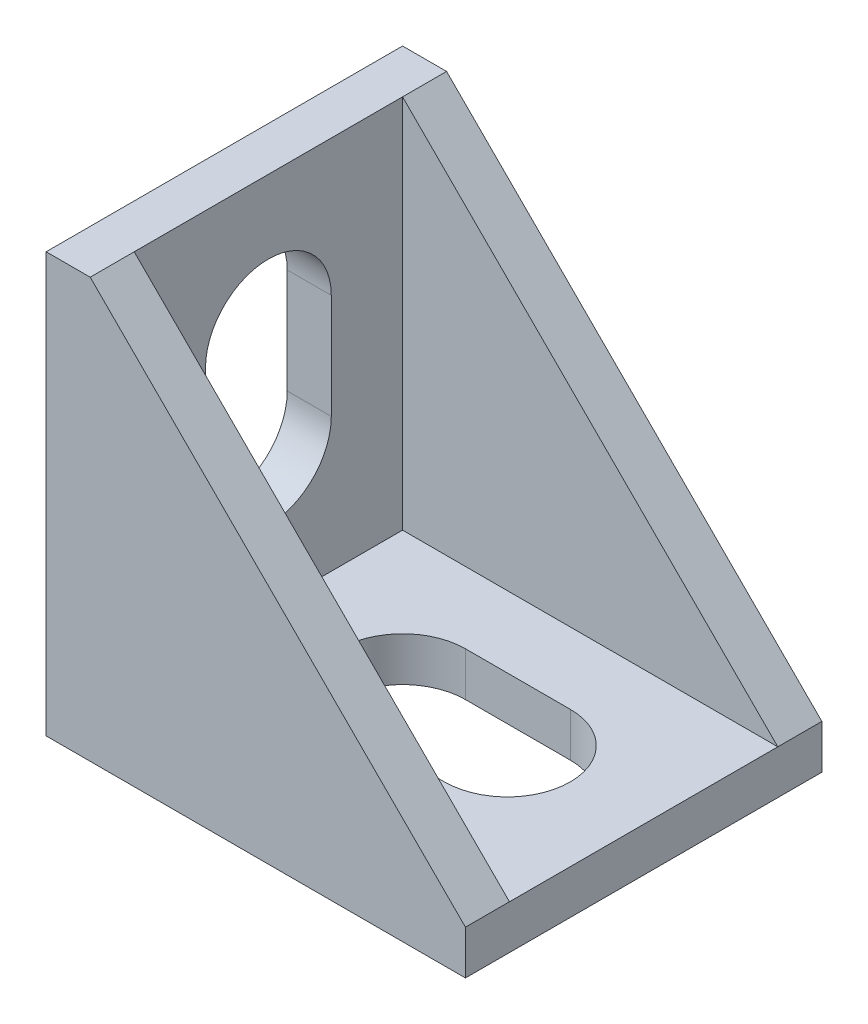
ISO-10303-21;
HEADER;
FILE_DESCRIPTION(('STEP AP214'),'2;1');
FILE_NAME('part.step','',(''),(''),'','','');
FILE_SCHEMA(('AUTOMOTIVE_DESIGN { 1 0 10303 214 1 1 1 1 }'));
ENDSEC;
DATA;
#1=APPLICATION_CONTEXT('core data for automotive mechanical design processes');
#2=APPLICATION_PROTOCOL_DEFINITION('international standard','automotive_design',2000,#1);
#3=PRODUCT_CONTEXT('',#1,'mechanical');
#4=PRODUCT('Part','Part','',(#3));
#5=PRODUCT_RELATED_PRODUCT_CATEGORY('part','',(#4));
#6=PRODUCT_DEFINITION_FORMATION('','',#4);
#7=PRODUCT_DEFINITION_CONTEXT('part definition',#1,'design');
#8=PRODUCT_DEFINITION('design','',#6,#7);
#9=PRODUCT_DEFINITION_SHAPE('','',#8);
#10=(LENGTH_UNIT() NAMED_UNIT(*) SI_UNIT(.MILLI.,.METRE.));
#11=(NAMED_UNIT(*) PLANE_ANGLE_UNIT() SI_UNIT($,.RADIAN.));
#12=(NAMED_UNIT(*) SI_UNIT($,.STERADIAN.) SOLID_ANGLE_UNIT());
#13=UNCERTAINTY_MEASURE_WITH_UNIT(LENGTH_MEASURE(1.E-05),#10,'distance_accuracy_value','');
#14=(GEOMETRIC_REPRESENTATION_CONTEXT(3) GLOBAL_UNCERTAINTY_ASSIGNED_CONTEXT((#13)) GLOBAL_UNIT_ASSIGNED_CONTEXT((#10,
#11,#12)) REPRESENTATION_CONTEXT('',''));
#15=CARTESIAN_POINT('',(0.,0.,0.));
#16=DIRECTION('',(0.,0.,1.));
#17=DIRECTION('',(1.,0.,0.));
#18=AXIS2_PLACEMENT_3D('',#15,#16,#17);
#19=CARTESIAN_POINT('',(20.,2.1,17.));
#20=DIRECTION('',(0.,-1.,0.));
#21=DIRECTION('',(1.,0.,0.));
#22=AXIS2_PLACEMENT_3D('',#19,#20,#21);
#23=PLANE('',#22);
#24=DIRECTION('',(1.,0.,0.));
#25=VECTOR('',#24,1.);
#26=CARTESIAN_POINT('',(8.5,2.1,11.5));
#27=LINE('',#26,#25);
#28=CARTESIAN_POINT('',(8.5,2.1,11.5));
#29=VERTEX_POINT('',#28);
#30=CARTESIAN_POINT('',(13.5,2.1,11.5));
#31=VERTEX_POINT('',#30);
#32=EDGE_CURVE('E176',#29,#31,#27,.T.);
#33=ORIENTED_EDGE('',*,*,#32,.F.);
#34=CARTESIAN_POINT('',(8.5,2.1,8.5));
#35=DIRECTION('',(0.,1.,0.));
#36=DIRECTION('',(-1.,0.,0.));
#37=AXIS2_PLACEMENT_3D('',#34,#35,#36);
#38=CIRCLE('',#37,3.);
#39=CARTESIAN_POINT('',(8.5,2.1,5.5));
#40=VERTEX_POINT('',#39);
#41=EDGE_CURVE('E51',#40,#29,#38,.T.);
#42=ORIENTED_EDGE('',*,*,#41,.F.);
#43=DIRECTION('',(-1.,0.,0.));
#44=VECTOR('',#43,1.);
#45=CARTESIAN_POINT('',(13.5,2.1,5.5));
#46=LINE('',#45,#44);
#47=CARTESIAN_POINT('',(13.5,2.1,5.5));
#48=VERTEX_POINT('',#47);
#49=EDGE_CURVE('E167',#48,#40,#46,.T.);
#50=ORIENTED_EDGE('',*,*,#49,.F.);
#51=CARTESIAN_POINT('',(13.5,2.1,8.5));
#52=DIRECTION('',(0.,1.,0.));
#53=DIRECTION('',(-1.,0.,0.));
#54=AXIS2_PLACEMENT_3D('',#51,#52,#53);
#55=CIRCLE('',#54,3.);
#56=EDGE_CURVE('E170',#31,#48,#55,.T.);
#57=ORIENTED_EDGE('',*,*,#56,.F.);
#58=EDGE_LOOP('',(#33,#42,#50,#57));
#59=FACE_BOUND('',#58,.T.);
#60=DIRECTION('',(1.,0.,0.));
#61=VECTOR('',#60,1.);
#62=CARTESIAN_POINT('',(2.1,2.1,14.9));
#63=LINE('',#62,#61);
#64=CARTESIAN_POINT('',(2.1,2.1,14.9));
#65=VERTEX_POINT('',#64);
#66=CARTESIAN_POINT('',(20.,2.1,14.9));
#67=VERTEX_POINT('',#66);
#68=EDGE_CURVE('E224',#65,#67,#63,.T.);
#69=ORIENTED_EDGE('',*,*,#68,.T.);
#70=DIRECTION('',(0.,0.,-1.));
#71=VECTOR('',#70,1.);
#72=CARTESIAN_POINT('',(20.,2.1,17.));
#73=LINE('',#72,#71);
#74=CARTESIAN_POINT('',(20.,2.1,2.1));
#75=VERTEX_POINT('',#74);
#76=EDGE_CURVE('E273',#67,#75,#73,.T.);
#77=ORIENTED_EDGE('',*,*,#76,.T.);
#78=DIRECTION('',(-1.,0.,0.));
#79=VECTOR('',#78,1.);
#80=CARTESIAN_POINT('',(2.1,2.1,2.1));
#81=LINE('',#80,#79);
#82=CARTESIAN_POINT('',(2.1,2.1,2.1));
#83=VERTEX_POINT('',#82);
#84=EDGE_CURVE('E232',#75,#83,#81,.T.);
#85=ORIENTED_EDGE('',*,*,#84,.T.);
#86=DIRECTION('',(0.,0.,-1.));
#87=VECTOR('',#86,1.);
#88=CARTESIAN_POINT('',(2.1,2.1,17.));
#89=LINE('',#88,#87);
#90=EDGE_CURVE('E271',#65,#83,#89,.T.);
#91=ORIENTED_EDGE('',*,*,#90,.F.);
#92=EDGE_LOOP('',(#69,#77,#85,#91));
#93=FACE_BOUND('',#92,.T.);
#94=ADVANCED_FACE('F36',(#59,#93),#23,.F.);
#95=CARTESIAN_POINT('',(2.1,2.1,17.));
#96=DIRECTION('',(-1.,0.,0.));
#97=DIRECTION('',(0.,-1.,0.));
#98=AXIS2_PLACEMENT_3D('',#95,#96,#97);
#99=PLANE('',#98);
#100=DIRECTION('',(0.,-1.,0.));
#101=VECTOR('',#100,1.);
#102=CARTESIAN_POINT('',(2.1,13.5,11.5));
#103=LINE('',#102,#101);
#104=CARTESIAN_POINT('',(2.1,13.5,11.5));
#105=VERTEX_POINT('',#104);
#106=CARTESIAN_POINT('',(2.1,8.5,11.5));
#107=VERTEX_POINT('',#106);
#108=EDGE_CURVE('E201',#105,#107,#103,.T.);
#109=ORIENTED_EDGE('',*,*,#108,.F.);
#110=CARTESIAN_POINT('',(2.1,13.5,8.5));
#111=DIRECTION('',(1.,0.,0.));
#112=DIRECTION('',(0.,1.,0.));
#113=AXIS2_PLACEMENT_3D('',#110,#111,#112);
#114=CIRCLE('',#113,3.);
#115=CARTESIAN_POINT('',(2.1,13.5,5.5));
#116=VERTEX_POINT('',#115);
#117=EDGE_CURVE('E182',#116,#105,#114,.T.);
#118=ORIENTED_EDGE('',*,*,#117,.F.);
#119=DIRECTION('',(0.,1.,0.));
#120=VECTOR('',#119,1.);
#121=CARTESIAN_POINT('',(2.1,13.5,5.5));
#122=LINE('',#121,#120);
#123=CARTESIAN_POINT('',(2.1,8.5,5.5));
#124=VERTEX_POINT('',#123);
#125=EDGE_CURVE('E190',#124,#116,#122,.T.);
#126=ORIENTED_EDGE('',*,*,#125,.F.);
#127=CARTESIAN_POINT('',(2.1,8.5,8.5));
#128=DIRECTION('',(1.,0.,0.));
#129=DIRECTION('',(0.,1.,0.));
#130=AXIS2_PLACEMENT_3D('',#127,#128,#129);
#131=CIRCLE('',#130,3.);
#132=EDGE_CURVE('E204',#107,#124,#131,.T.);
#133=ORIENTED_EDGE('',*,*,#132,.F.);
#134=EDGE_LOOP('',(#109,#118,#126,#133));
#135=FACE_BOUND('',#134,.T.);
#136=DIRECTION('',(0.,-1.,0.));
#137=VECTOR('',#136,1.);
#138=CARTESIAN_POINT('',(2.1,20.,14.9));
#139=LINE('',#138,#137);
#140=CARTESIAN_POINT('',(2.1,20.,14.9));
#141=VERTEX_POINT('',#140);
#142=EDGE_CURVE('E221',#141,#65,#139,.T.);
#143=ORIENTED_EDGE('',*,*,#142,.T.);
#144=ORIENTED_EDGE('',*,*,#90,.T.);
#145=DIRECTION('',(0.,1.,0.));
#146=VECTOR('',#145,1.);
#147=CARTESIAN_POINT('',(2.1,20.,2.1));
#148=LINE('',#147,#146);
#149=CARTESIAN_POINT('',(2.1,20.,2.1));
#150=VERTEX_POINT('',#149);
#151=EDGE_CURVE('E235',#83,#150,#148,.T.);
#152=ORIENTED_EDGE('',*,*,#151,.T.);
#153=DIRECTION('',(0.,0.,-1.));
#154=VECTOR('',#153,1.);
#155=CARTESIAN_POINT('',(2.1,20.,17.));
#156=LINE('',#155,#154);
#157=EDGE_CURVE('E267',#141,#150,#156,.T.);
#158=ORIENTED_EDGE('',*,*,#157,.F.);
#159=EDGE_LOOP('',(#143,#144,#152,#158));
#160=FACE_BOUND('',#159,.T.);
#161=ADVANCED_FACE('F304',(#135,#160),#99,.F.);
#162=CARTESIAN_POINT('',(0.,20.,17.));
#163=DIRECTION('',(1.,0.,0.));
#164=DIRECTION('',(0.,0.,-1.));
#165=AXIS2_PLACEMENT_3D('',#162,#163,#164);
#166=PLANE('',#165);
#167=DIRECTION('',(0.,1.,0.));
#168=VECTOR('',#167,1.);
#169=CARTESIAN_POINT('',(0.,13.5,5.5));
#170=LINE('',#169,#168);
#171=CARTESIAN_POINT('',(0.,8.5,5.5));
#172=VERTEX_POINT('',#171);
#173=CARTESIAN_POINT('',(0.,13.5,5.5));
#174=VERTEX_POINT('',#173);
#175=EDGE_CURVE('E196',#172,#174,#170,.T.);
#176=ORIENTED_EDGE('',*,*,#175,.T.);
#177=CARTESIAN_POINT('',(0.,13.5,8.5));
#178=DIRECTION('',(1.,0.,0.));
#179=DIRECTION('',(0.,1.,0.));
#180=AXIS2_PLACEMENT_3D('',#177,#178,#179);
#181=CIRCLE('',#180,3.);
#182=CARTESIAN_POINT('',(0.,13.5,11.5));
#183=VERTEX_POINT('',#182);
#184=EDGE_CURVE('E186',#174,#183,#181,.T.);
#185=ORIENTED_EDGE('',*,*,#184,.T.);
#186=DIRECTION('',(0.,-1.,0.));
#187=VECTOR('',#186,1.);
#188=CARTESIAN_POINT('',(0.,13.5,11.5));
#189=LINE('',#188,#187);
#190=CARTESIAN_POINT('',(0.,8.5,11.5));
#191=VERTEX_POINT('',#190);
#192=EDGE_CURVE('E189',#183,#191,#189,.T.);
#193=ORIENTED_EDGE('',*,*,#192,.T.);
#194=CARTESIAN_POINT('',(0.,8.5,8.5));
#195=DIRECTION('',(1.,0.,0.));
#196=DIRECTION('',(0.,1.,0.));
#197=AXIS2_PLACEMENT_3D('',#194,#195,#196);
#198=CIRCLE('',#197,3.);
#199=EDGE_CURVE('E193',#191,#172,#198,.T.);
#200=ORIENTED_EDGE('',*,*,#199,.T.);
#201=EDGE_LOOP('',(#176,#185,#193,#200));
#202=FACE_BOUND('',#201,.T.);
#203=DIRECTION('',(0.,-1.,0.));
#204=VECTOR('',#203,1.);
#205=CARTESIAN_POINT('',(0.,20.,0.));
#206=LINE('',#205,#204);
#207=CARTESIAN_POINT('',(0.,20.,0.));
#208=VERTEX_POINT('',#207);
#209=CARTESIAN_POINT('',(0.,0.,0.));
#210=VERTEX_POINT('',#209);
#211=EDGE_CURVE('E243',#208,#210,#206,.T.);
#212=ORIENTED_EDGE('',*,*,#211,.T.);
#213=DIRECTION('',(0.,0.,-1.));
#214=VECTOR('',#213,1.);
#215=CARTESIAN_POINT('',(0.,0.,17.));
#216=LINE('',#215,#214);
#217=CARTESIAN_POINT('',(0.,0.,17.));
#218=VERTEX_POINT('',#217);
#219=EDGE_CURVE('E11',#218,#210,#216,.T.);
#220=ORIENTED_EDGE('',*,*,#219,.F.);
#221=DIRECTION('',(0.,-1.,0.));
#222=VECTOR('',#221,1.);
#223=CARTESIAN_POINT('',(0.,20.,17.));
#224=LINE('',#223,#222);
#225=CARTESIAN_POINT('',(0.,20.,17.));
#226=VERTEX_POINT('',#225);
#227=EDGE_CURVE('E246',#226,#218,#224,.T.);
#228=ORIENTED_EDGE('',*,*,#227,.F.);
#229=DIRECTION('',(0.,0.,-1.));
#230=VECTOR('',#229,1.);
#231=CARTESIAN_POINT('',(0.,20.,17.));
#232=LINE('',#231,#230);
#233=EDGE_CURVE('E257',#226,#208,#232,.T.);
#234=ORIENTED_EDGE('',*,*,#233,.T.);
#235=EDGE_LOOP('',(#212,#220,#228,#234));
#236=FACE_BOUND('',#235,.T.);
#237=ADVANCED_FACE('F38',(#202,#236),#166,.F.);
#238=CARTESIAN_POINT('',(0.,0.,17.));
#239=DIRECTION('',(0.,1.,0.));
#240=DIRECTION('',(0.,0.,1.));
#241=AXIS2_PLACEMENT_3D('',#238,#239,#240);
#242=PLANE('',#241);
#243=DIRECTION('',(-1.,0.,0.));
#244=VECTOR('',#243,1.);
#245=CARTESIAN_POINT('',(13.5,0.,5.5));
#246=LINE('',#245,#244);
#247=CARTESIAN_POINT('',(13.5,0.,5.5));
#248=VERTEX_POINT('',#247);
#249=CARTESIAN_POINT('',(8.5,0.,5.5));
#250=VERTEX_POINT('',#249);
#251=EDGE_CURVE('E157',#248,#250,#246,.T.);
#252=ORIENTED_EDGE('',*,*,#251,.T.);
#253=CARTESIAN_POINT('',(8.5,0.,8.5));
#254=DIRECTION('',(0.,1.,0.));
#255=DIRECTION('',(-1.,0.,0.));
#256=AXIS2_PLACEMENT_3D('',#253,#254,#255);
#257=CIRCLE('',#256,3.);
#258=CARTESIAN_POINT('',(8.5,0.,11.5));
#259=VERTEX_POINT('',#258);
#260=EDGE_CURVE('E151',#250,#259,#257,.T.);
#261=ORIENTED_EDGE('',*,*,#260,.T.);
#262=DIRECTION('',(1.,0.,0.));
#263=VECTOR('',#262,1.);
#264=CARTESIAN_POINT('',(8.5,0.,11.5));
#265=LINE('',#264,#263);
#266=CARTESIAN_POINT('',(13.5,0.,11.5));
#267=VERTEX_POINT('',#266);
#268=EDGE_CURVE('E160',#259,#267,#265,.T.);
#269=ORIENTED_EDGE('',*,*,#268,.T.);
#270=CARTESIAN_POINT('',(13.5,0.,8.5));
#271=DIRECTION('',(0.,1.,0.));
#272=DIRECTION('',(-1.,0.,0.));
#273=AXIS2_PLACEMENT_3D('',#270,#271,#272);
#274=CIRCLE('',#273,3.);
#275=EDGE_CURVE('E59',#267,#248,#274,.T.);
#276=ORIENTED_EDGE('',*,*,#275,.T.);
#277=EDGE_LOOP('',(#252,#261,#269,#276));
#278=FACE_BOUND('',#277,.T.);
#279=DIRECTION('',(1.,0.,0.));
#280=VECTOR('',#279,1.);
#281=CARTESIAN_POINT('',(0.,0.,0.));
#282=LINE('',#281,#280);
#283=CARTESIAN_POINT('',(20.,0.,0.));
#284=VERTEX_POINT('',#283);
#285=EDGE_CURVE('E260',#210,#284,#282,.T.);
#286=ORIENTED_EDGE('',*,*,#285,.T.);
#287=DIRECTION('',(0.,0.,-1.));
#288=VECTOR('',#287,1.);
#289=CARTESIAN_POINT('',(20.,0.,17.));
#290=LINE('',#289,#288);
#291=CARTESIAN_POINT('',(20.,0.,17.));
#292=VERTEX_POINT('',#291);
#293=EDGE_CURVE('E44',#292,#284,#290,.T.);
#294=ORIENTED_EDGE('',*,*,#293,.F.);
#295=DIRECTION('',(1.,0.,0.));
#296=VECTOR('',#295,1.);
#297=CARTESIAN_POINT('',(0.,0.,17.));
#298=LINE('',#297,#296);
#299=EDGE_CURVE('E249',#218,#292,#298,.T.);
#300=ORIENTED_EDGE('',*,*,#299,.F.);
#301=ORIENTED_EDGE('',*,*,#219,.T.);
#302=EDGE_LOOP('',(#286,#294,#300,#301));
#303=FACE_BOUND('',#302,.T.);
#304=ADVANCED_FACE('F164',(#278,#303),#242,.F.);
#305=CARTESIAN_POINT('',(20.,0.,17.));
#306=DIRECTION('',(-1.,0.,0.));
#307=DIRECTION('',(0.,0.,1.));
#308=AXIS2_PLACEMENT_3D('',#305,#306,#307);
#309=PLANE('',#308);
#310=DIRECTION('',(0.,1.,0.));
#311=VECTOR('',#310,1.);
#312=CARTESIAN_POINT('',(20.,0.,0.));
#313=LINE('',#312,#311);
#314=CARTESIAN_POINT('',(20.,2.1,0.));
#315=VERTEX_POINT('',#314);
#316=EDGE_CURVE('E262',#284,#315,#313,.T.);
#317=ORIENTED_EDGE('',*,*,#316,.T.);
#318=DIRECTION('',(0.,0.,-1.));
#319=VECTOR('',#318,1.);
#320=CARTESIAN_POINT('',(20.,2.1,2.1));
#321=LINE('',#320,#319);
#322=EDGE_CURVE('E238',#75,#315,#321,.T.);
#323=ORIENTED_EDGE('',*,*,#322,.F.);
#324=ORIENTED_EDGE('',*,*,#76,.F.);
#325=CARTESIAN_POINT('',(20.,2.1,17.));
#326=VERTEX_POINT('',#325);
#327=EDGE_CURVE('E274',#326,#67,#73,.T.);
#328=ORIENTED_EDGE('',*,*,#327,.F.);
#329=DIRECTION('',(0.,1.,0.));
#330=VECTOR('',#329,1.);
#331=CARTESIAN_POINT('',(20.,0.,17.));
#332=LINE('',#331,#330);
#333=EDGE_CURVE('E252',#292,#326,#332,.T.);
#334=ORIENTED_EDGE('',*,*,#333,.F.);
#335=ORIENTED_EDGE('',*,*,#293,.T.);
#336=EDGE_LOOP('',(#317,#323,#324,#328,#334,#335));
#337=FACE_BOUND('',#336,.T.);
#338=ADVANCED_FACE('F280',(#337),#309,.F.);
#339=CARTESIAN_POINT('',(2.1,20.,17.));
#340=DIRECTION('',(0.,-1.,0.));
#341=DIRECTION('',(0.,0.,-1.));
#342=AXIS2_PLACEMENT_3D('',#339,#340,#341);
#343=PLANE('',#342);
#344=DIRECTION('',(-1.,0.,0.));
#345=VECTOR('',#344,1.);
#346=CARTESIAN_POINT('',(2.1,20.,0.));
#347=LINE('',#346,#345);
#348=CARTESIAN_POINT('',(2.1,20.,0.));
#349=VERTEX_POINT('',#348);
#350=EDGE_CURVE('E250',#349,#208,#347,.T.);
#351=ORIENTED_EDGE('',*,*,#350,.T.);
#352=ORIENTED_EDGE('',*,*,#233,.F.);
#353=DIRECTION('',(-1.,0.,0.));
#354=VECTOR('',#353,1.);
#355=CARTESIAN_POINT('',(2.1,20.,17.));
#356=LINE('',#355,#354);
#357=CARTESIAN_POINT('',(2.1,20.,17.));
#358=VERTEX_POINT('',#357);
#359=EDGE_CURVE('E255',#358,#226,#356,.T.);
#360=ORIENTED_EDGE('',*,*,#359,.F.);
#361=EDGE_CURVE('E268',#358,#141,#156,.T.);
#362=ORIENTED_EDGE('',*,*,#361,.T.);
#363=ORIENTED_EDGE('',*,*,#157,.T.);
#364=DIRECTION('',(0.,0.,-1.));
#365=VECTOR('',#364,1.);
#366=CARTESIAN_POINT('',(2.1,20.,2.1));
#367=LINE('',#366,#365);
#368=EDGE_CURVE('E241',#150,#349,#367,.T.);
#369=ORIENTED_EDGE('',*,*,#368,.T.);
#370=EDGE_LOOP('',(#351,#352,#360,#362,#363,#369));
#371=FACE_BOUND('',#370,.T.);
#372=ADVANCED_FACE('F308',(#371),#343,.F.);
#373=CARTESIAN_POINT('',(0.,0.,17.));
#374=DIRECTION('',(0.,0.,1.));
#375=DIRECTION('',(1.,0.,0.));
#376=AXIS2_PLACEMENT_3D('',#373,#374,#375);
#377=PLANE('',#376);
#378=ORIENTED_EDGE('',*,*,#227,.T.);
#379=ORIENTED_EDGE('',*,*,#299,.T.);
#380=ORIENTED_EDGE('',*,*,#333,.T.);
#381=DIRECTION('',(-0.707106781186548,0.707106781186548,0.));
#382=VECTOR('',#381,1.);
#383=CARTESIAN_POINT('',(20.,2.1,17.));
#384=LINE('',#383,#382);
#385=EDGE_CURVE('E211',#326,#358,#384,.T.);
#386=ORIENTED_EDGE('',*,*,#385,.T.);
#387=ORIENTED_EDGE('',*,*,#359,.T.);
#388=EDGE_LOOP('',(#378,#379,#380,#386,#387));
#389=FACE_BOUND('',#388,.T.);
#390=ADVANCED_FACE('F313',(#389),#377,.T.);
#391=CARTESIAN_POINT('',(0.,0.,0.));
#392=DIRECTION('',(0.,0.,1.));
#393=DIRECTION('',(1.,0.,0.));
#394=AXIS2_PLACEMENT_3D('',#391,#392,#393);
#395=PLANE('',#394);
#396=ORIENTED_EDGE('',*,*,#350,.F.);
#397=DIRECTION('',(0.707106781186548,-0.707106781186548,0.));
#398=VECTOR('',#397,1.);
#399=CARTESIAN_POINT('',(20.,2.1,0.));
#400=LINE('',#399,#398);
#401=EDGE_CURVE('E227',#349,#315,#400,.T.);
#402=ORIENTED_EDGE('',*,*,#401,.T.);
#403=ORIENTED_EDGE('',*,*,#316,.F.);
#404=ORIENTED_EDGE('',*,*,#285,.F.);
#405=ORIENTED_EDGE('',*,*,#211,.F.);
#406=EDGE_LOOP('',(#396,#402,#403,#404,#405));
#407=FACE_BOUND('',#406,.T.);
#408=ADVANCED_FACE('F285',(#407),#395,.F.);
#409=CARTESIAN_POINT('',(20.,2.1,2.1));
#410=DIRECTION('',(0.707106781186548,0.707106781186548,0.));
#411=DIRECTION('',(-0.707106781186548,0.707106781186548,0.));
#412=AXIS2_PLACEMENT_3D('',#409,#410,#411);
#413=PLANE('',#412);
#414=ORIENTED_EDGE('',*,*,#401,.F.);
#415=ORIENTED_EDGE('',*,*,#368,.F.);
#416=DIRECTION('',(0.707106781186548,-0.707106781186548,0.));
#417=VECTOR('',#416,1.);
#418=CARTESIAN_POINT('',(20.,2.1,2.1));
#419=LINE('',#418,#417);
#420=EDGE_CURVE('E229',#150,#75,#419,.T.);
#421=ORIENTED_EDGE('',*,*,#420,.T.);
#422=ORIENTED_EDGE('',*,*,#322,.T.);
#423=EDGE_LOOP('',(#414,#415,#421,#422));
#424=FACE_BOUND('',#423,.T.);
#425=ADVANCED_FACE('F290',(#424),#413,.T.);
#426=CARTESIAN_POINT('',(0.,0.,2.1));
#427=DIRECTION('',(0.,0.,1.));
#428=DIRECTION('',(1.,0.,0.));
#429=AXIS2_PLACEMENT_3D('',#426,#427,#428);
#430=PLANE('',#429);
#431=ORIENTED_EDGE('',*,*,#420,.F.);
#432=ORIENTED_EDGE('',*,*,#151,.F.);
#433=ORIENTED_EDGE('',*,*,#84,.F.);
#434=EDGE_LOOP('',(#431,#432,#433));
#435=FACE_BOUND('',#434,.T.);
#436=ADVANCED_FACE('F296',(#435),#430,.T.);
#437=CARTESIAN_POINT('',(20.,2.1,14.9));
#438=DIRECTION('',(0.707106781186548,0.707106781186548,0.));
#439=DIRECTION('',(-0.707106781186548,0.707106781186548,0.));
#440=AXIS2_PLACEMENT_3D('',#437,#438,#439);
#441=PLANE('',#440);
#442=ORIENTED_EDGE('',*,*,#385,.F.);
#443=ORIENTED_EDGE('',*,*,#327,.T.);
#444=DIRECTION('',(-0.707106781186548,0.707106781186548,0.));
#445=VECTOR('',#444,1.);
#446=CARTESIAN_POINT('',(20.,2.1,14.9));
#447=LINE('',#446,#445);
#448=EDGE_CURVE('E218',#67,#141,#447,.T.);
#449=ORIENTED_EDGE('',*,*,#448,.T.);
#450=ORIENTED_EDGE('',*,*,#361,.F.);
#451=EDGE_LOOP('',(#442,#443,#449,#450));
#452=FACE_BOUND('',#451,.T.);
#453=ADVANCED_FACE('F311',(#452),#441,.T.);
#454=CARTESIAN_POINT('',(0.,0.,14.9));
#455=DIRECTION('',(0.,0.,1.));
#456=DIRECTION('',(1.,0.,0.));
#457=AXIS2_PLACEMENT_3D('',#454,#455,#456);
#458=PLANE('',#457);
#459=ORIENTED_EDGE('',*,*,#448,.F.);
#460=ORIENTED_EDGE('',*,*,#68,.F.);
#461=ORIENTED_EDGE('',*,*,#142,.F.);
#462=EDGE_LOOP('',(#459,#460,#461));
#463=FACE_BOUND('',#462,.T.);
#464=ADVANCED_FACE('F301',(#463),#458,.F.);
#465=CARTESIAN_POINT('',(0.,13.5,8.5));
#466=DIRECTION('',(1.,0.,0.));
#467=DIRECTION('',(0.,1.,0.));
#468=AXIS2_PLACEMENT_3D('',#465,#466,#467);
#469=CYLINDRICAL_SURFACE('',#468,3.);
#470=ORIENTED_EDGE('',*,*,#117,.T.);
#471=DIRECTION('',(1.,0.,0.));
#472=VECTOR('',#471,1.);
#473=CARTESIAN_POINT('',(0.,13.5,11.5));
#474=LINE('',#473,#472);
#475=EDGE_CURVE('E199',#183,#105,#474,.T.);
#476=ORIENTED_EDGE('',*,*,#475,.F.);
#477=ORIENTED_EDGE('',*,*,#184,.F.);
#478=DIRECTION('',(1.,0.,0.));
#479=VECTOR('',#478,1.);
#480=CARTESIAN_POINT('',(0.,13.5,5.5));
#481=LINE('',#480,#479);
#482=EDGE_CURVE('E209',#174,#116,#481,.T.);
#483=ORIENTED_EDGE('',*,*,#482,.T.);
#484=EDGE_LOOP('',(#470,#476,#477,#483));
#485=FACE_BOUND('',#484,.T.);
#486=ADVANCED_FACE('F351',(#485),#469,.F.);
#487=CARTESIAN_POINT('',(0.,13.5,5.5));
#488=DIRECTION('',(0.,0.,-1.));
#489=DIRECTION('',(-1.,0.,0.));
#490=AXIS2_PLACEMENT_3D('',#487,#488,#489);
#491=PLANE('',#490);
#492=ORIENTED_EDGE('',*,*,#125,.T.);
#493=ORIENTED_EDGE('',*,*,#482,.F.);
#494=ORIENTED_EDGE('',*,*,#175,.F.);
#495=DIRECTION('',(1.,0.,0.));
#496=VECTOR('',#495,1.);
#497=CARTESIAN_POINT('',(0.,8.5,5.5));
#498=LINE('',#497,#496);
#499=EDGE_CURVE('E212',#172,#124,#498,.T.);
#500=ORIENTED_EDGE('',*,*,#499,.T.);
#501=EDGE_LOOP('',(#492,#493,#494,#500));
#502=FACE_BOUND('',#501,.T.);
#503=ADVANCED_FACE('F354',(#502),#491,.F.);
#504=CARTESIAN_POINT('',(0.,8.5,8.5));
#505=DIRECTION('',(1.,0.,0.));
#506=DIRECTION('',(0.,1.,0.));
#507=AXIS2_PLACEMENT_3D('',#504,#505,#506);
#508=CYLINDRICAL_SURFACE('',#507,3.);
#509=ORIENTED_EDGE('',*,*,#132,.T.);
#510=ORIENTED_EDGE('',*,*,#499,.F.);
#511=ORIENTED_EDGE('',*,*,#199,.F.);
#512=DIRECTION('',(1.,0.,0.));
#513=VECTOR('',#512,1.);
#514=CARTESIAN_POINT('',(0.,8.5,11.5));
#515=LINE('',#514,#513);
#516=EDGE_CURVE('E214',#191,#107,#515,.T.);
#517=ORIENTED_EDGE('',*,*,#516,.T.);
#518=EDGE_LOOP('',(#509,#510,#511,#517));
#519=FACE_BOUND('',#518,.T.);
#520=ADVANCED_FACE('F359',(#519),#508,.F.);
#521=CARTESIAN_POINT('',(0.,13.5,11.5));
#522=DIRECTION('',(0.,0.,1.));
#523=DIRECTION('',(1.,0.,0.));
#524=AXIS2_PLACEMENT_3D('',#521,#522,#523);
#525=PLANE('',#524);
#526=ORIENTED_EDGE('',*,*,#108,.T.);
#527=ORIENTED_EDGE('',*,*,#516,.F.);
#528=ORIENTED_EDGE('',*,*,#192,.F.);
#529=ORIENTED_EDGE('',*,*,#475,.T.);
#530=EDGE_LOOP('',(#526,#527,#528,#529));
#531=FACE_BOUND('',#530,.T.);
#532=ADVANCED_FACE('F356',(#531),#525,.F.);
#533=CARTESIAN_POINT('',(8.5,0.,8.5));
#534=DIRECTION('',(0.,1.,0.));
#535=DIRECTION('',(-1.,0.,0.));
#536=AXIS2_PLACEMENT_3D('',#533,#534,#535);
#537=CYLINDRICAL_SURFACE('',#536,3.);
#538=ORIENTED_EDGE('',*,*,#41,.T.);
#539=DIRECTION('',(0.,1.,0.));
#540=VECTOR('',#539,1.);
#541=CARTESIAN_POINT('',(8.5,0.,11.5));
#542=LINE('',#541,#540);
#543=EDGE_CURVE('E147',#259,#29,#542,.T.);
#544=ORIENTED_EDGE('',*,*,#543,.F.);
#545=ORIENTED_EDGE('',*,*,#260,.F.);
#546=DIRECTION('',(0.,1.,0.));
#547=VECTOR('',#546,1.);
#548=CARTESIAN_POINT('',(8.5,0.,5.5));
#549=LINE('',#548,#547);
#550=EDGE_CURVE('E180',#250,#40,#549,.T.);
#551=ORIENTED_EDGE('',*,*,#550,.T.);
#552=EDGE_LOOP('',(#538,#544,#545,#551));
#553=FACE_BOUND('',#552,.T.);
#554=ADVANCED_FACE('F149',(#553),#537,.F.);
#555=CARTESIAN_POINT('',(13.5,0.,5.5));
#556=DIRECTION('',(0.,0.,-1.));
#557=DIRECTION('',(-1.,0.,0.));
#558=AXIS2_PLACEMENT_3D('',#555,#556,#557);
#559=PLANE('',#558);
#560=ORIENTED_EDGE('',*,*,#49,.T.);
#561=ORIENTED_EDGE('',*,*,#550,.F.);
#562=ORIENTED_EDGE('',*,*,#251,.F.);
#563=DIRECTION('',(0.,1.,0.));
#564=VECTOR('',#563,1.);
#565=CARTESIAN_POINT('',(13.5,0.,5.5));
#566=LINE('',#565,#564);
#567=EDGE_CURVE('E183',#248,#48,#566,.T.);
#568=ORIENTED_EDGE('',*,*,#567,.T.);
#569=EDGE_LOOP('',(#560,#561,#562,#568));
#570=FACE_BOUND('',#569,.T.);
#571=ADVANCED_FACE('F369',(#570),#559,.F.);
#572=CARTESIAN_POINT('',(13.5,0.,8.5));
#573=DIRECTION('',(0.,1.,0.));
#574=DIRECTION('',(-1.,0.,0.));
#575=AXIS2_PLACEMENT_3D('',#572,#573,#574);
#576=CYLINDRICAL_SURFACE('',#575,3.);
#577=ORIENTED_EDGE('',*,*,#56,.T.);
#578=ORIENTED_EDGE('',*,*,#567,.F.);
#579=ORIENTED_EDGE('',*,*,#275,.F.);
#580=DIRECTION('',(0.,1.,0.));
#581=VECTOR('',#580,1.);
#582=CARTESIAN_POINT('',(13.5,0.,11.5));
#583=LINE('',#582,#581);
#584=EDGE_CURVE('E156',#267,#31,#583,.T.);
#585=ORIENTED_EDGE('',*,*,#584,.T.);
#586=EDGE_LOOP('',(#577,#578,#579,#585));
#587=FACE_BOUND('',#586,.T.);
#588=ADVANCED_FACE('F372',(#587),#576,.F.);
#589=CARTESIAN_POINT('',(8.5,0.,11.5));
#590=DIRECTION('',(0.,0.,1.));
#591=DIRECTION('',(1.,0.,0.));
#592=AXIS2_PLACEMENT_3D('',#589,#590,#591);
#593=PLANE('',#592);
#594=ORIENTED_EDGE('',*,*,#32,.T.);
#595=ORIENTED_EDGE('',*,*,#584,.F.);
#596=ORIENTED_EDGE('',*,*,#268,.F.);
#597=ORIENTED_EDGE('',*,*,#543,.T.);
#598=EDGE_LOOP('',(#594,#595,#596,#597));
#599=FACE_BOUND('',#598,.T.);
#600=ADVANCED_FACE('F161',(#599),#593,.F.);
#601=CLOSED_SHELL('',(#94,#161,#237,#304,#338,#372,#390,#408,#425,#436,#453,#464,#486,#503,#520,
#532,#554,#571,#588,#600));
#602=MANIFOLD_SOLID_BREP('B2',#601);
#603=ADVANCED_BREP_SHAPE_REPRESENTATION('',(#18,#602),#14);
#604=SHAPE_DEFINITION_REPRESENTATION(#9,#603);
ENDSEC;
END-ISO-10303-21;
